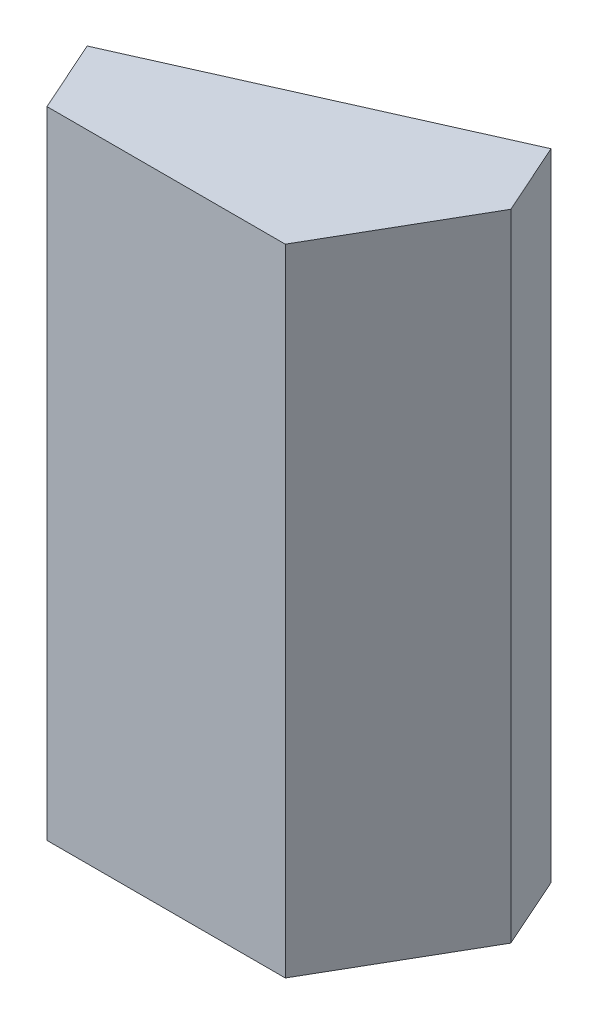
ISO-10303-21;
HEADER;
FILE_DESCRIPTION(('STEP AP214'),'2;1');
FILE_NAME('part.step','',(''),(''),'','','');
FILE_SCHEMA(('AUTOMOTIVE_DESIGN { 1 0 10303 214 1 1 1 1 }'));
ENDSEC;
DATA;
#1=APPLICATION_CONTEXT('core data for automotive mechanical design processes');
#2=APPLICATION_PROTOCOL_DEFINITION('international standard','automotive_design',2000,#1);
#3=PRODUCT_CONTEXT('',#1,'mechanical');
#4=PRODUCT('Part','Part','',(#3));
#5=PRODUCT_RELATED_PRODUCT_CATEGORY('part','',(#4));
#6=PRODUCT_DEFINITION_FORMATION('','',#4);
#7=PRODUCT_DEFINITION_CONTEXT('part definition',#1,'design');
#8=PRODUCT_DEFINITION('design','',#6,#7);
#9=PRODUCT_DEFINITION_SHAPE('','',#8);
#10=(LENGTH_UNIT() NAMED_UNIT(*) SI_UNIT(.MILLI.,.METRE.));
#11=(NAMED_UNIT(*) PLANE_ANGLE_UNIT() SI_UNIT($,.RADIAN.));
#12=(NAMED_UNIT(*) SI_UNIT($,.STERADIAN.) SOLID_ANGLE_UNIT());
#13=UNCERTAINTY_MEASURE_WITH_UNIT(LENGTH_MEASURE(1.E-05),#10,'distance_accuracy_value','');
#14=(GEOMETRIC_REPRESENTATION_CONTEXT(3) GLOBAL_UNCERTAINTY_ASSIGNED_CONTEXT((#13)) GLOBAL_UNIT_ASSIGNED_CONTEXT((#10,
#11,#12)) REPRESENTATION_CONTEXT('',''));
#15=CARTESIAN_POINT('',(0.,0.,0.));
#16=DIRECTION('',(0.,0.,1.));
#17=DIRECTION('',(1.,0.,0.));
#18=AXIS2_PLACEMENT_3D('',#15,#16,#17);
#19=CARTESIAN_POINT('',(-19.05,50.8,0.));
#20=DIRECTION('',(0.913409392915174,0.,-0.407042111991293));
#21=DIRECTION('',(-0.407042111991293,0.,-0.913409392915175));
#22=AXIS2_PLACEMENT_3D('',#19,#20,#21);
#23=PLANE('',#22);
#24=DIRECTION('',(0.407042111991293,0.,0.913409392915174));
#25=VECTOR('',#24,1.);
#26=CARTESIAN_POINT('',(-19.05,0.,0.));
#27=LINE('',#26,#25);
#28=CARTESIAN_POINT('',(-21.6347174111447,0.,-5.80014964501136));
#29=VERTEX_POINT('',#28);
#30=CARTESIAN_POINT('',(-19.05,0.,0.));
#31=VERTEX_POINT('',#30);
#32=EDGE_CURVE('E107',#29,#31,#27,.T.);
#33=ORIENTED_EDGE('',*,*,#32,.T.);
#34=DIRECTION('',(0.,-1.,0.));
#35=VECTOR('',#34,1.);
#36=CARTESIAN_POINT('',(-19.05,50.8,0.));
#37=LINE('',#36,#35);
#38=CARTESIAN_POINT('',(-19.05,50.8,0.));
#39=VERTEX_POINT('',#38);
#40=EDGE_CURVE('E11',#39,#31,#37,.T.);
#41=ORIENTED_EDGE('',*,*,#40,.F.);
#42=DIRECTION('',(0.407042111991293,0.,0.913409392915174));
#43=VECTOR('',#42,1.);
#44=CARTESIAN_POINT('',(-19.05,50.8,0.));
#45=LINE('',#44,#43);
#46=CARTESIAN_POINT('',(-21.6347174111447,50.8,-5.80014964501136));
#47=VERTEX_POINT('',#46);
#48=EDGE_CURVE('E115',#47,#39,#45,.T.);
#49=ORIENTED_EDGE('',*,*,#48,.F.);
#50=DIRECTION('',(0.,-1.,0.));
#51=VECTOR('',#50,1.);
#52=CARTESIAN_POINT('',(-21.6347174111447,50.8,-5.80014964501136));
#53=LINE('',#52,#51);
#54=EDGE_CURVE('E103',#47,#29,#53,.T.);
#55=ORIENTED_EDGE('',*,*,#54,.T.);
#56=EDGE_LOOP('',(#33,#41,#49,#55));
#57=FACE_BOUND('',#56,.T.);
#58=ADVANCED_FACE('F33',(#57),#23,.F.);
#59=CARTESIAN_POINT('',(-19.05,50.8,0.));
#60=DIRECTION('',(0.,0.,-1.));
#61=DIRECTION('',(-1.,0.,0.));
#62=AXIS2_PLACEMENT_3D('',#59,#60,#61);
#63=PLANE('',#62);
#64=DIRECTION('',(1.,0.,0.));
#65=VECTOR('',#64,1.);
#66=CARTESIAN_POINT('',(-19.05,0.,0.));
#67=LINE('',#66,#65);
#68=CARTESIAN_POINT('',(0.,0.,0.));
#69=VERTEX_POINT('',#68);
#70=EDGE_CURVE('E110',#31,#69,#67,.T.);
#71=ORIENTED_EDGE('',*,*,#70,.T.);
#72=DIRECTION('',(0.,-1.,0.));
#73=VECTOR('',#72,1.);
#74=CARTESIAN_POINT('',(0.,50.8,0.));
#75=LINE('',#74,#73);
#76=CARTESIAN_POINT('',(0.,50.8,0.));
#77=VERTEX_POINT('',#76);
#78=EDGE_CURVE('E41',#77,#69,#75,.T.);
#79=ORIENTED_EDGE('',*,*,#78,.F.);
#80=DIRECTION('',(1.,0.,0.));
#81=VECTOR('',#80,1.);
#82=CARTESIAN_POINT('',(-19.05,50.8,0.));
#83=LINE('',#82,#81);
#84=EDGE_CURVE('E83',#39,#77,#83,.T.);
#85=ORIENTED_EDGE('',*,*,#84,.F.);
#86=ORIENTED_EDGE('',*,*,#40,.T.);
#87=EDGE_LOOP('',(#71,#79,#85,#86));
#88=FACE_BOUND('',#87,.T.);
#89=ADVANCED_FACE('F134',(#88),#63,.F.);
#90=CARTESIAN_POINT('',(0.,50.8,0.));
#91=DIRECTION('',(-0.86602540378444,0.,-0.499999999999998));
#92=DIRECTION('',(-0.499999999999998,0.,0.86602540378444));
#93=AXIS2_PLACEMENT_3D('',#90,#91,#92);
#94=PLANE('',#93);
#95=DIRECTION('',(0.499999999999998,0.,-0.86602540378444));
#96=VECTOR('',#95,1.);
#97=CARTESIAN_POINT('',(0.,0.,0.));
#98=LINE('',#97,#96);
#99=CARTESIAN_POINT('',(6.59911357683738,0.,-11.43));
#100=VERTEX_POINT('',#99);
#101=EDGE_CURVE('E98',#69,#100,#98,.T.);
#102=ORIENTED_EDGE('',*,*,#101,.T.);
#103=DIRECTION('',(0.,-1.,0.));
#104=VECTOR('',#103,1.);
#105=CARTESIAN_POINT('',(6.59911357683738,50.8,-11.43));
#106=LINE('',#105,#104);
#107=CARTESIAN_POINT('',(6.59911357683738,50.8,-11.43));
#108=VERTEX_POINT('',#107);
#109=EDGE_CURVE('E95',#108,#100,#106,.T.);
#110=ORIENTED_EDGE('',*,*,#109,.F.);
#111=DIRECTION('',(0.499999999999998,0.,-0.86602540378444));
#112=VECTOR('',#111,1.);
#113=CARTESIAN_POINT('',(0.,50.8,0.));
#114=LINE('',#113,#112);
#115=EDGE_CURVE('E87',#77,#108,#114,.T.);
#116=ORIENTED_EDGE('',*,*,#115,.F.);
#117=ORIENTED_EDGE('',*,*,#78,.T.);
#118=EDGE_LOOP('',(#102,#110,#116,#117));
#119=FACE_BOUND('',#118,.T.);
#120=ADVANCED_FACE('F96',(#119),#94,.F.);
#121=CARTESIAN_POINT('',(4.01439616569267,50.8,-17.2301496450114));
#122=DIRECTION('',(-0.913409392915174,0.,0.407042111991294));
#123=DIRECTION('',(0.407042111991294,0.,0.913409392915174));
#124=AXIS2_PLACEMENT_3D('',#121,#122,#123);
#125=PLANE('',#124);
#126=DIRECTION('',(-0.407042111991294,0.,-0.913409392915174));
#127=VECTOR('',#126,1.);
#128=CARTESIAN_POINT('',(4.01439616569267,0.,-17.2301496450114));
#129=LINE('',#128,#127);
#130=CARTESIAN_POINT('',(4.01439616569267,0.,-17.2301496450114));
#131=VERTEX_POINT('',#130);
#132=EDGE_CURVE('E69',#100,#131,#129,.T.);
#133=ORIENTED_EDGE('',*,*,#132,.T.);
#134=DIRECTION('',(0.,-1.,0.));
#135=VECTOR('',#134,1.);
#136=CARTESIAN_POINT('',(4.01439616569267,50.8,-17.2301496450114));
#137=LINE('',#136,#135);
#138=CARTESIAN_POINT('',(4.01439616569267,50.8,-17.2301496450114));
#139=VERTEX_POINT('',#138);
#140=EDGE_CURVE('E99',#139,#131,#137,.T.);
#141=ORIENTED_EDGE('',*,*,#140,.F.);
#142=DIRECTION('',(-0.407042111991294,0.,-0.913409392915174));
#143=VECTOR('',#142,1.);
#144=CARTESIAN_POINT('',(4.01439616569267,50.8,-17.2301496450114));
#145=LINE('',#144,#143);
#146=EDGE_CURVE('E91',#108,#139,#145,.T.);
#147=ORIENTED_EDGE('',*,*,#146,.F.);
#148=ORIENTED_EDGE('',*,*,#109,.T.);
#149=EDGE_LOOP('',(#133,#141,#147,#148));
#150=FACE_BOUND('',#149,.T.);
#151=ADVANCED_FACE('F101',(#150),#125,.F.);
#152=CARTESIAN_POINT('',(-21.6347174111447,50.8,-5.80014964501136));
#153=DIRECTION('',(0.407042111991293,0.,0.913409392915174));
#154=DIRECTION('',(0.913409392915175,0.,-0.407042111991293));
#155=AXIS2_PLACEMENT_3D('',#152,#153,#154);
#156=PLANE('',#155);
#157=DIRECTION('',(-0.913409392915174,0.,0.407042111991293));
#158=VECTOR('',#157,1.);
#159=CARTESIAN_POINT('',(-21.6347174111447,0.,-5.80014964501136));
#160=LINE('',#159,#158);
#161=EDGE_CURVE('E75',#131,#29,#160,.T.);
#162=ORIENTED_EDGE('',*,*,#161,.T.);
#163=ORIENTED_EDGE('',*,*,#54,.F.);
#164=DIRECTION('',(-0.913409392915174,0.,0.407042111991293));
#165=VECTOR('',#164,1.);
#166=CARTESIAN_POINT('',(-21.6347174111447,50.8,-5.80014964501136));
#167=LINE('',#166,#165);
#168=EDGE_CURVE('E49',#139,#47,#167,.T.);
#169=ORIENTED_EDGE('',*,*,#168,.F.);
#170=ORIENTED_EDGE('',*,*,#140,.T.);
#171=EDGE_LOOP('',(#162,#163,#169,#170));
#172=FACE_BOUND('',#171,.T.);
#173=ADVANCED_FACE('F123',(#172),#156,.F.);
#174=CARTESIAN_POINT('',(0.,50.8,0.));
#175=DIRECTION('',(0.,-1.,0.));
#176=DIRECTION('',(0.,0.,-1.));
#177=AXIS2_PLACEMENT_3D('',#174,#175,#176);
#178=PLANE('',#177);
#179=ORIENTED_EDGE('',*,*,#48,.T.);
#180=ORIENTED_EDGE('',*,*,#84,.T.);
#181=ORIENTED_EDGE('',*,*,#115,.T.);
#182=ORIENTED_EDGE('',*,*,#146,.T.);
#183=ORIENTED_EDGE('',*,*,#168,.T.);
#184=EDGE_LOOP('',(#179,#180,#181,#182,#183));
#185=FACE_BOUND('',#184,.T.);
#186=ADVANCED_FACE('F89',(#185),#178,.F.);
#187=CARTESIAN_POINT('',(0.,0.,0.));
#188=DIRECTION('',(0.,-1.,0.));
#189=DIRECTION('',(0.,0.,-1.));
#190=AXIS2_PLACEMENT_3D('',#187,#188,#189);
#191=PLANE('',#190);
#192=ORIENTED_EDGE('',*,*,#32,.F.);
#193=ORIENTED_EDGE('',*,*,#161,.F.);
#194=ORIENTED_EDGE('',*,*,#132,.F.);
#195=ORIENTED_EDGE('',*,*,#101,.F.);
#196=ORIENTED_EDGE('',*,*,#70,.F.);
#197=EDGE_LOOP('',(#192,#193,#194,#195,#196));
#198=FACE_BOUND('',#197,.T.);
#199=ADVANCED_FACE('F119',(#198),#191,.T.);
#200=CLOSED_SHELL('',(#58,#89,#120,#151,#173,#186,#199));
#201=MANIFOLD_SOLID_BREP('B2',#200);
#202=ADVANCED_BREP_SHAPE_REPRESENTATION('',(#18,#201),#14);
#203=SHAPE_DEFINITION_REPRESENTATION(#9,#202);
ENDSEC;
END-ISO-10303-21;
